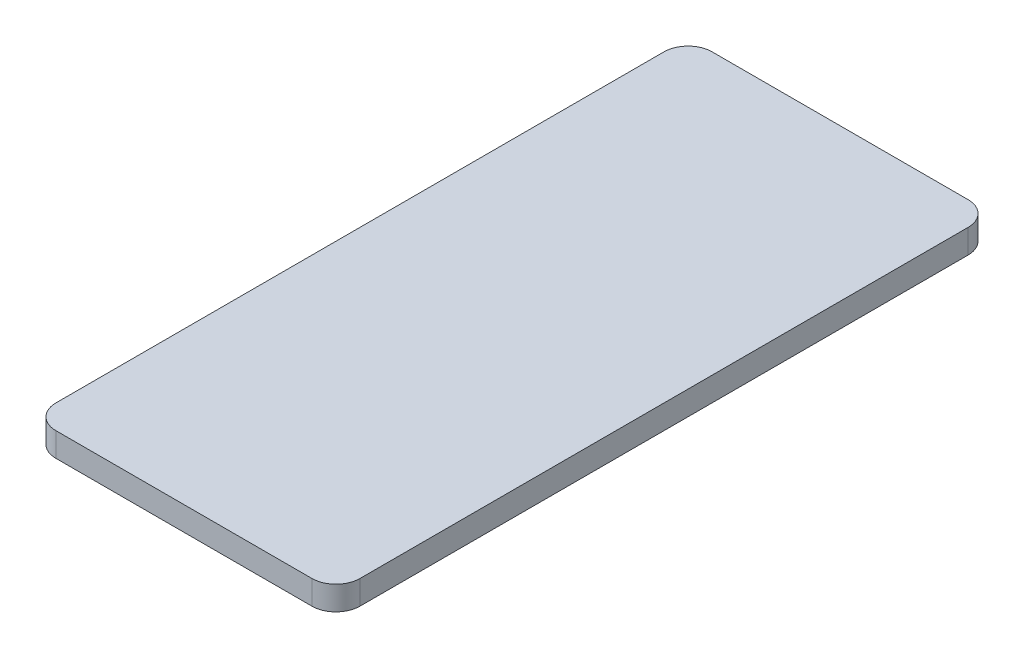
ISO-10303-21;
HEADER;
FILE_DESCRIPTION(('STEP AP214'),'2;1');
FILE_NAME('part.step','',(''),(''),'','','');
FILE_SCHEMA(('AUTOMOTIVE_DESIGN { 1 0 10303 214 1 1 1 1 }'));
ENDSEC;
DATA;
#1=APPLICATION_CONTEXT('core data for automotive mechanical design processes');
#2=APPLICATION_PROTOCOL_DEFINITION('international standard','automotive_design',2000,#1);
#3=PRODUCT_CONTEXT('',#1,'mechanical');
#4=PRODUCT('Part','Part','',(#3));
#5=PRODUCT_RELATED_PRODUCT_CATEGORY('part','',(#4));
#6=PRODUCT_DEFINITION_FORMATION('','',#4);
#7=PRODUCT_DEFINITION_CONTEXT('part definition',#1,'design');
#8=PRODUCT_DEFINITION('design','',#6,#7);
#9=PRODUCT_DEFINITION_SHAPE('','',#8);
#10=(LENGTH_UNIT() NAMED_UNIT(*) SI_UNIT(.MILLI.,.METRE.));
#11=(NAMED_UNIT(*) PLANE_ANGLE_UNIT() SI_UNIT($,.RADIAN.));
#12=(NAMED_UNIT(*) SI_UNIT($,.STERADIAN.) SOLID_ANGLE_UNIT());
#13=UNCERTAINTY_MEASURE_WITH_UNIT(LENGTH_MEASURE(1.E-05),#10,'distance_accuracy_value','');
#14=(GEOMETRIC_REPRESENTATION_CONTEXT(3) GLOBAL_UNCERTAINTY_ASSIGNED_CONTEXT((#13)) GLOBAL_UNIT_ASSIGNED_CONTEXT((#10,
#11,#12)) REPRESENTATION_CONTEXT('',''));
#15=CARTESIAN_POINT('',(0.,0.,0.));
#16=DIRECTION('',(0.,0.,1.));
#17=DIRECTION('',(1.,0.,0.));
#18=AXIS2_PLACEMENT_3D('',#15,#16,#17);
#19=CARTESIAN_POINT('',(-16.,3.,38.));
#20=DIRECTION('',(0.,-1.,0.));
#21=DIRECTION('',(0.,0.,-1.));
#22=AXIS2_PLACEMENT_3D('',#19,#20,#21);
#23=CYLINDRICAL_SURFACE('',#22,3.);
#24=CARTESIAN_POINT('',(-16.,0.,38.));
#25=DIRECTION('',(0.,1.,0.));
#26=DIRECTION('',(0.,0.,-1.));
#27=AXIS2_PLACEMENT_3D('',#24,#25,#26);
#28=CIRCLE('',#27,3.);
#29=CARTESIAN_POINT('',(-19.,0.,38.));
#30=VERTEX_POINT('',#29);
#31=CARTESIAN_POINT('',(-16.,0.,41.));
#32=VERTEX_POINT('',#31);
#33=EDGE_CURVE('E141',#30,#32,#28,.T.);
#34=ORIENTED_EDGE('',*,*,#33,.T.);
#35=DIRECTION('',(0.,-1.,0.));
#36=VECTOR('',#35,1.);
#37=CARTESIAN_POINT('',(-16.,3.,41.));
#38=LINE('',#37,#36);
#39=CARTESIAN_POINT('',(-16.,3.,41.));
#40=VERTEX_POINT('',#39);
#41=EDGE_CURVE('E11',#40,#32,#38,.T.);
#42=ORIENTED_EDGE('',*,*,#41,.F.);
#43=CARTESIAN_POINT('',(-16.,3.,38.));
#44=DIRECTION('',(0.,1.,0.));
#45=DIRECTION('',(0.,0.,-1.));
#46=AXIS2_PLACEMENT_3D('',#43,#44,#45);
#47=CIRCLE('',#46,3.);
#48=CARTESIAN_POINT('',(-19.,3.,38.));
#49=VERTEX_POINT('',#48);
#50=EDGE_CURVE('E155',#49,#40,#47,.T.);
#51=ORIENTED_EDGE('',*,*,#50,.F.);
#52=DIRECTION('',(0.,-1.,0.));
#53=VECTOR('',#52,1.);
#54=CARTESIAN_POINT('',(-19.,3.,38.));
#55=LINE('',#54,#53);
#56=EDGE_CURVE('E137',#49,#30,#55,.T.);
#57=ORIENTED_EDGE('',*,*,#56,.T.);
#58=EDGE_LOOP('',(#34,#42,#51,#57));
#59=FACE_BOUND('',#58,.T.);
#60=ADVANCED_FACE('F45',(#59),#23,.T.);
#61=CARTESIAN_POINT('',(-16.,3.,41.));
#62=DIRECTION('',(0.,0.,-1.));
#63=DIRECTION('',(-1.,0.,0.));
#64=AXIS2_PLACEMENT_3D('',#61,#62,#63);
#65=PLANE('',#64);
#66=DIRECTION('',(1.,0.,0.));
#67=VECTOR('',#66,1.);
#68=CARTESIAN_POINT('',(-16.,0.,41.));
#69=LINE('',#68,#67);
#70=CARTESIAN_POINT('',(16.,0.,41.));
#71=VERTEX_POINT('',#70);
#72=EDGE_CURVE('E144',#32,#71,#69,.T.);
#73=ORIENTED_EDGE('',*,*,#72,.T.);
#74=DIRECTION('',(0.,-1.,0.));
#75=VECTOR('',#74,1.);
#76=CARTESIAN_POINT('',(16.,3.,41.));
#77=LINE('',#76,#75);
#78=CARTESIAN_POINT('',(16.,3.,41.));
#79=VERTEX_POINT('',#78);
#80=EDGE_CURVE('E53',#79,#71,#77,.T.);
#81=ORIENTED_EDGE('',*,*,#80,.F.);
#82=DIRECTION('',(1.,0.,0.));
#83=VECTOR('',#82,1.);
#84=CARTESIAN_POINT('',(-16.,3.,41.));
#85=LINE('',#84,#83);
#86=EDGE_CURVE('E104',#40,#79,#85,.T.);
#87=ORIENTED_EDGE('',*,*,#86,.F.);
#88=ORIENTED_EDGE('',*,*,#41,.T.);
#89=EDGE_LOOP('',(#73,#81,#87,#88));
#90=FACE_BOUND('',#89,.T.);
#91=ADVANCED_FACE('F190',(#90),#65,.F.);
#92=CARTESIAN_POINT('',(16.,3.,38.));
#93=DIRECTION('',(0.,-1.,0.));
#94=DIRECTION('',(0.,0.,-1.));
#95=AXIS2_PLACEMENT_3D('',#92,#93,#94);
#96=CYLINDRICAL_SURFACE('',#95,3.);
#97=CARTESIAN_POINT('',(16.,0.,38.));
#98=DIRECTION('',(0.,1.,0.));
#99=DIRECTION('',(0.,0.,1.));
#100=AXIS2_PLACEMENT_3D('',#97,#98,#99);
#101=CIRCLE('',#100,3.);
#102=CARTESIAN_POINT('',(19.,0.,38.));
#103=VERTEX_POINT('',#102);
#104=EDGE_CURVE('E146',#71,#103,#101,.T.);
#105=ORIENTED_EDGE('',*,*,#104,.T.);
#106=DIRECTION('',(0.,-1.,0.));
#107=VECTOR('',#106,1.);
#108=CARTESIAN_POINT('',(19.,3.,38.));
#109=LINE('',#108,#107);
#110=CARTESIAN_POINT('',(19.,3.,38.));
#111=VERTEX_POINT('',#110);
#112=EDGE_CURVE('E162',#111,#103,#109,.T.);
#113=ORIENTED_EDGE('',*,*,#112,.F.);
#114=CARTESIAN_POINT('',(16.,3.,38.));
#115=DIRECTION('',(0.,1.,0.));
#116=DIRECTION('',(0.,0.,1.));
#117=AXIS2_PLACEMENT_3D('',#114,#115,#116);
#118=CIRCLE('',#117,3.);
#119=EDGE_CURVE('E170',#79,#111,#118,.T.);
#120=ORIENTED_EDGE('',*,*,#119,.F.);
#121=ORIENTED_EDGE('',*,*,#80,.T.);
#122=EDGE_LOOP('',(#105,#113,#120,#121));
#123=FACE_BOUND('',#122,.T.);
#124=ADVANCED_FACE('F168',(#123),#96,.T.);
#125=CARTESIAN_POINT('',(19.,3.,38.));
#126=DIRECTION('',(-1.,0.,0.));
#127=DIRECTION('',(0.,0.,1.));
#128=AXIS2_PLACEMENT_3D('',#125,#126,#127);
#129=PLANE('',#128);
#130=DIRECTION('',(0.,0.,-1.));
#131=VECTOR('',#130,1.);
#132=CARTESIAN_POINT('',(19.,0.,38.));
#133=LINE('',#132,#131);
#134=CARTESIAN_POINT('',(19.,0.,-38.));
#135=VERTEX_POINT('',#134);
#136=EDGE_CURVE('E148',#103,#135,#133,.T.);
#137=ORIENTED_EDGE('',*,*,#136,.T.);
#138=DIRECTION('',(0.,-1.,0.));
#139=VECTOR('',#138,1.);
#140=CARTESIAN_POINT('',(19.,3.,-38.));
#141=LINE('',#140,#139);
#142=CARTESIAN_POINT('',(19.,3.,-38.));
#143=VERTEX_POINT('',#142);
#144=EDGE_CURVE('E159',#143,#135,#141,.T.);
#145=ORIENTED_EDGE('',*,*,#144,.F.);
#146=DIRECTION('',(0.,0.,-1.));
#147=VECTOR('',#146,1.);
#148=CARTESIAN_POINT('',(19.,3.,38.));
#149=LINE('',#148,#147);
#150=EDGE_CURVE('E182',#111,#143,#149,.T.);
#151=ORIENTED_EDGE('',*,*,#150,.F.);
#152=ORIENTED_EDGE('',*,*,#112,.T.);
#153=EDGE_LOOP('',(#137,#145,#151,#152));
#154=FACE_BOUND('',#153,.T.);
#155=ADVANCED_FACE('F178',(#154),#129,.F.);
#156=CARTESIAN_POINT('',(16.,3.,-38.));
#157=DIRECTION('',(0.,-1.,0.));
#158=DIRECTION('',(0.,0.,-1.));
#159=AXIS2_PLACEMENT_3D('',#156,#157,#158);
#160=CYLINDRICAL_SURFACE('',#159,3.);
#161=CARTESIAN_POINT('',(16.,0.,-38.));
#162=DIRECTION('',(0.,1.,0.));
#163=DIRECTION('',(0.,0.,-1.));
#164=AXIS2_PLACEMENT_3D('',#161,#162,#163);
#165=CIRCLE('',#164,3.);
#166=CARTESIAN_POINT('',(16.,0.,-41.));
#167=VERTEX_POINT('',#166);
#168=EDGE_CURVE('E150',#135,#167,#165,.T.);
#169=ORIENTED_EDGE('',*,*,#168,.T.);
#170=DIRECTION('',(0.,-1.,0.));
#171=VECTOR('',#170,1.);
#172=CARTESIAN_POINT('',(16.,3.,-41.));
#173=LINE('',#172,#171);
#174=CARTESIAN_POINT('',(16.,3.,-41.));
#175=VERTEX_POINT('',#174);
#176=EDGE_CURVE('E132',#175,#167,#173,.T.);
#177=ORIENTED_EDGE('',*,*,#176,.F.);
#178=CARTESIAN_POINT('',(16.,3.,-38.));
#179=DIRECTION('',(0.,1.,0.));
#180=DIRECTION('',(0.,0.,-1.));
#181=AXIS2_PLACEMENT_3D('',#178,#179,#180);
#182=CIRCLE('',#181,3.);
#183=EDGE_CURVE('E123',#143,#175,#182,.T.);
#184=ORIENTED_EDGE('',*,*,#183,.F.);
#185=ORIENTED_EDGE('',*,*,#144,.T.);
#186=EDGE_LOOP('',(#169,#177,#184,#185));
#187=FACE_BOUND('',#186,.T.);
#188=ADVANCED_FACE('F181',(#187),#160,.T.);
#189=CARTESIAN_POINT('',(-16.,3.,-41.));
#190=DIRECTION('',(0.,0.,1.));
#191=DIRECTION('',(1.,0.,0.));
#192=AXIS2_PLACEMENT_3D('',#189,#190,#191);
#193=PLANE('',#192);
#194=DIRECTION('',(-1.,0.,0.));
#195=VECTOR('',#194,1.);
#196=CARTESIAN_POINT('',(-16.,0.,-41.));
#197=LINE('',#196,#195);
#198=CARTESIAN_POINT('',(-16.,0.,-41.));
#199=VERTEX_POINT('',#198);
#200=EDGE_CURVE('E131',#167,#199,#197,.T.);
#201=ORIENTED_EDGE('',*,*,#200,.T.);
#202=DIRECTION('',(0.,-1.,0.));
#203=VECTOR('',#202,1.);
#204=CARTESIAN_POINT('',(-16.,3.,-41.));
#205=LINE('',#204,#203);
#206=CARTESIAN_POINT('',(-16.,3.,-41.));
#207=VERTEX_POINT('',#206);
#208=EDGE_CURVE('E128',#207,#199,#205,.T.);
#209=ORIENTED_EDGE('',*,*,#208,.F.);
#210=DIRECTION('',(-1.,0.,0.));
#211=VECTOR('',#210,1.);
#212=CARTESIAN_POINT('',(-16.,3.,-41.));
#213=LINE('',#212,#211);
#214=EDGE_CURVE('E117',#175,#207,#213,.T.);
#215=ORIENTED_EDGE('',*,*,#214,.F.);
#216=ORIENTED_EDGE('',*,*,#176,.T.);
#217=EDGE_LOOP('',(#201,#209,#215,#216));
#218=FACE_BOUND('',#217,.T.);
#219=ADVANCED_FACE('F129',(#218),#193,.F.);
#220=CARTESIAN_POINT('',(-16.,3.,-38.));
#221=DIRECTION('',(0.,-1.,0.));
#222=DIRECTION('',(0.,0.,-1.));
#223=AXIS2_PLACEMENT_3D('',#220,#221,#222);
#224=CYLINDRICAL_SURFACE('',#223,3.);
#225=CARTESIAN_POINT('',(-16.,0.,-38.));
#226=DIRECTION('',(0.,1.,0.));
#227=DIRECTION('',(0.,0.,-1.));
#228=AXIS2_PLACEMENT_3D('',#225,#226,#227);
#229=CIRCLE('',#228,3.);
#230=CARTESIAN_POINT('',(-19.,0.,-38.));
#231=VERTEX_POINT('',#230);
#232=EDGE_CURVE('E90',#199,#231,#229,.T.);
#233=ORIENTED_EDGE('',*,*,#232,.T.);
#234=DIRECTION('',(0.,-1.,0.));
#235=VECTOR('',#234,1.);
#236=CARTESIAN_POINT('',(-19.,3.,-38.));
#237=LINE('',#236,#235);
#238=CARTESIAN_POINT('',(-19.,3.,-38.));
#239=VERTEX_POINT('',#238);
#240=EDGE_CURVE('E133',#239,#231,#237,.T.);
#241=ORIENTED_EDGE('',*,*,#240,.F.);
#242=CARTESIAN_POINT('',(-16.,3.,-38.));
#243=DIRECTION('',(0.,1.,0.));
#244=DIRECTION('',(0.,0.,-1.));
#245=AXIS2_PLACEMENT_3D('',#242,#243,#244);
#246=CIRCLE('',#245,3.);
#247=EDGE_CURVE('E121',#207,#239,#246,.T.);
#248=ORIENTED_EDGE('',*,*,#247,.F.);
#249=ORIENTED_EDGE('',*,*,#208,.T.);
#250=EDGE_LOOP('',(#233,#241,#248,#249));
#251=FACE_BOUND('',#250,.T.);
#252=ADVANCED_FACE('F135',(#251),#224,.T.);
#253=CARTESIAN_POINT('',(-19.,3.,38.));
#254=DIRECTION('',(1.,0.,0.));
#255=DIRECTION('',(0.,0.,-1.));
#256=AXIS2_PLACEMENT_3D('',#253,#254,#255);
#257=PLANE('',#256);
#258=DIRECTION('',(0.,0.,1.));
#259=VECTOR('',#258,1.);
#260=CARTESIAN_POINT('',(-19.,0.,38.));
#261=LINE('',#260,#259);
#262=EDGE_CURVE('E96',#231,#30,#261,.T.);
#263=ORIENTED_EDGE('',*,*,#262,.T.);
#264=ORIENTED_EDGE('',*,*,#56,.F.);
#265=DIRECTION('',(0.,0.,1.));
#266=VECTOR('',#265,1.);
#267=CARTESIAN_POINT('',(-19.,3.,38.));
#268=LINE('',#267,#266);
#269=EDGE_CURVE('E61',#239,#49,#268,.T.);
#270=ORIENTED_EDGE('',*,*,#269,.F.);
#271=ORIENTED_EDGE('',*,*,#240,.T.);
#272=EDGE_LOOP('',(#263,#264,#270,#271));
#273=FACE_BOUND('',#272,.T.);
#274=ADVANCED_FACE('F206',(#273),#257,.F.);
#275=CARTESIAN_POINT('',(-16.,3.,38.));
#276=DIRECTION('',(0.,-1.,0.));
#277=DIRECTION('',(0.,0.,-1.));
#278=AXIS2_PLACEMENT_3D('',#275,#276,#277);
#279=PLANE('',#278);
#280=ORIENTED_EDGE('',*,*,#50,.T.);
#281=ORIENTED_EDGE('',*,*,#86,.T.);
#282=ORIENTED_EDGE('',*,*,#119,.T.);
#283=ORIENTED_EDGE('',*,*,#150,.T.);
#284=ORIENTED_EDGE('',*,*,#183,.T.);
#285=ORIENTED_EDGE('',*,*,#214,.T.);
#286=ORIENTED_EDGE('',*,*,#247,.T.);
#287=ORIENTED_EDGE('',*,*,#269,.T.);
#288=EDGE_LOOP('',(#280,#281,#282,#283,#284,#285,#286,#287));
#289=FACE_BOUND('',#288,.T.);
#290=ADVANCED_FACE('F119',(#289),#279,.F.);
#291=CARTESIAN_POINT('',(-16.,0.,38.));
#292=DIRECTION('',(0.,-1.,0.));
#293=DIRECTION('',(0.,0.,-1.));
#294=AXIS2_PLACEMENT_3D('',#291,#292,#293);
#295=PLANE('',#294);
#296=ORIENTED_EDGE('',*,*,#33,.F.);
#297=ORIENTED_EDGE('',*,*,#262,.F.);
#298=ORIENTED_EDGE('',*,*,#232,.F.);
#299=ORIENTED_EDGE('',*,*,#200,.F.);
#300=ORIENTED_EDGE('',*,*,#168,.F.);
#301=ORIENTED_EDGE('',*,*,#136,.F.);
#302=ORIENTED_EDGE('',*,*,#104,.F.);
#303=ORIENTED_EDGE('',*,*,#72,.F.);
#304=EDGE_LOOP('',(#296,#297,#298,#299,#300,#301,#302,#303));
#305=FACE_BOUND('',#304,.T.);
#306=ADVANCED_FACE('F174',(#305),#295,.T.);
#307=CLOSED_SHELL('',(#60,#91,#124,#155,#188,#219,#252,#274,#290,#306));
#308=MANIFOLD_SOLID_BREP('B2',#307);
#309=ADVANCED_BREP_SHAPE_REPRESENTATION('',(#18,#308),#14);
#310=SHAPE_DEFINITION_REPRESENTATION(#9,#309);
ENDSEC;
END-ISO-10303-21;
